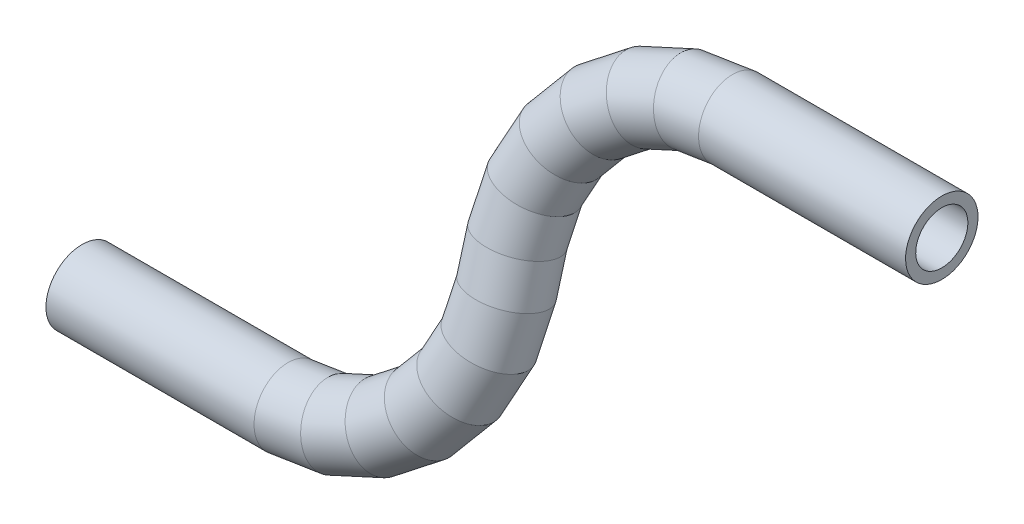
ISO-10303-21;
HEADER;
FILE_DESCRIPTION(('STEP AP214'),'2;1');
FILE_NAME('part.step','',(''),(''),'','','');
FILE_SCHEMA(('AUTOMOTIVE_DESIGN { 1 0 10303 214 1 1 1 1 }'));
ENDSEC;
DATA;
#1=APPLICATION_CONTEXT('core data for automotive mechanical design processes');
#2=APPLICATION_PROTOCOL_DEFINITION('international standard','automotive_design',2000,#1);
#3=PRODUCT_CONTEXT('',#1,'mechanical');
#4=PRODUCT('Part','Part','',(#3));
#5=PRODUCT_RELATED_PRODUCT_CATEGORY('part','',(#4));
#6=PRODUCT_DEFINITION_FORMATION('','',#4);
#7=PRODUCT_DEFINITION_CONTEXT('part definition',#1,'design');
#8=PRODUCT_DEFINITION('design','',#6,#7);
#9=PRODUCT_DEFINITION_SHAPE('','',#8);
#10=(LENGTH_UNIT() NAMED_UNIT(*) SI_UNIT(.MILLI.,.METRE.));
#11=(NAMED_UNIT(*) PLANE_ANGLE_UNIT() SI_UNIT($,.RADIAN.));
#12=(NAMED_UNIT(*) SI_UNIT($,.STERADIAN.) SOLID_ANGLE_UNIT());
#13=UNCERTAINTY_MEASURE_WITH_UNIT(LENGTH_MEASURE(1.E-05),#10,'distance_accuracy_value','');
#14=(GEOMETRIC_REPRESENTATION_CONTEXT(3) GLOBAL_UNCERTAINTY_ASSIGNED_CONTEXT((#13)) GLOBAL_UNIT_ASSIGNED_CONTEXT((#10,
#11,#12)) REPRESENTATION_CONTEXT('',''));
#15=CARTESIAN_POINT('',(0.,0.,0.));
#16=DIRECTION('',(0.,0.,1.));
#17=DIRECTION('',(1.,0.,0.));
#18=AXIS2_PLACEMENT_3D('',#15,#16,#17);
#19=CARTESIAN_POINT('',(-2802.49044779569,-59.0884651807333,-10.4188906600165));
#20=DIRECTION('',(-1.,0.,0.));
#21=DIRECTION('',(0.,0.,1.));
#22=AXIS2_PLACEMENT_3D('',#19,#20,#21);
#23=CYLINDRICAL_SURFACE('',#22,3.175);
#24=CARTESIAN_POINT('',(-2803.09277838077,-59.0884651807324,-10.4188906600161));
#25=DIRECTION('',(-0.997858923238604,-0.0630268367093302,0.0174696069649534));
#26=DIRECTION('',(0.065403129230141,-0.961603705422154,0.266534696437986));
#27=AXIS2_PLACEMENT_3D('',#24,#25,#26);
#28=ELLIPSE('',#27,3.18181250481318,3.175);
#29=CARTESIAN_POINT('',(-2802.88467788634,-62.1481078753193,-9.5708272299231));
#30=VERTEX_POINT('',#29);
#31=EDGE_CURVE('E45',#30,#30,#28,.T.);
#32=ORIENTED_EDGE('',*,*,#31,.T.);
#33=EDGE_LOOP('',(#32));
#34=FACE_BOUND('',#33,.T.);
#35=CARTESIAN_POINT('',(-2821.29277838078,-59.0884651807333,-10.4188906600165));
#36=DIRECTION('',(1.,0.,0.));
#37=DIRECTION('',(0.,0.,-1.));
#38=AXIS2_PLACEMENT_3D('',#35,#36,#37);
#39=CIRCLE('',#38,3.175);
#40=CARTESIAN_POINT('',(-2821.29277838078,-59.0884651807333,-13.5938906600165));
#41=VERTEX_POINT('',#40);
#42=EDGE_CURVE('E98',#41,#41,#39,.T.);
#43=ORIENTED_EDGE('',*,*,#42,.T.);
#44=EDGE_LOOP('',(#43));
#45=FACE_BOUND('',#44,.T.);
#46=ADVANCED_FACE('F39',(#34,#45),#23,.T.);
#47=CARTESIAN_POINT('',(-2798.11098455573,-58.4564291523097,-10.5940766852192));
#48=DIRECTION('',(-0.991444861373811,-0.125783782827815,0.0348644063909001));
#49=DIRECTION('',(0.125860299372411,-0.992047975171507,0.));
#50=AXIS2_PLACEMENT_3D('',#47,#48,#49);
#51=CYLINDRICAL_SURFACE('',#50,3.175);
#52=CARTESIAN_POINT('',(-2799.21049270424,-58.5959228342657,-10.5554122063225));
#53=DIRECTION('',(-0.965925826289071,-0.249415370257592,0.0691322731222119));
#54=DIRECTION('',(0.258819045102511,-0.930830833989973,0.258005155734833));
#55=AXIS2_PLACEMENT_3D('',#52,#53,#54);
#56=ELLIPSE('',#55,3.20239694984198,3.175);
#57=CARTESIAN_POINT('',(-2798.38165138364,-61.5768126578541,-9.72917728255378));
#58=VERTEX_POINT('',#57);
#59=EDGE_CURVE('E136',#58,#58,#56,.T.);
#60=ORIENTED_EDGE('',*,*,#59,.T.);
#61=EDGE_LOOP('',(#60));
#62=FACE_BOUND('',#61,.T.);
#63=ORIENTED_EDGE('',*,*,#31,.F.);
#64=EDGE_LOOP('',(#63));
#65=FACE_BOUND('',#64,.T.);
#66=ADVANCED_FACE('F144',(#62,#65),#51,.T.);
#67=CARTESIAN_POINT('',(-2794.56819989556,-56.7428869598459,-11.0690316438229));
#68=DIRECTION('',(-0.923879532511293,-0.368779391551257,0.102217267493316));
#69=DIRECTION('',(0.370721193089206,-0.928744204285828,0.));
#70=AXIS2_PLACEMENT_3D('',#67,#68,#69);
#71=CYLINDRICAL_SURFACE('',#70,3.175);
#72=CARTESIAN_POINT('',(-2795.59277838077,-57.1518617418139,-10.9556731274737));
#73=DIRECTION('',(-0.866025403784437,-0.481833495210536,0.133553296077634));
#74=DIRECTION('',(0.500000000000002,-0.83456009449314,0.231321094324751));
#75=AXIS2_PLACEMENT_3D('',#72,#73,#74);
#76=ELLIPSE('',#75,3.20239694984199,3.175);
#77=CARTESIAN_POINT('',(-2793.99157990585,-59.8244544428786,-10.214891160574));
#78=VERTEX_POINT('',#77);
#79=EDGE_CURVE('E131',#78,#78,#76,.T.);
#80=ORIENTED_EDGE('',*,*,#79,.T.);
#81=EDGE_LOOP('',(#80));
#82=FACE_BOUND('',#81,.T.);
#83=ORIENTED_EDGE('',*,*,#59,.F.);
#84=EDGE_LOOP('',(#83));
#85=FACE_BOUND('',#84,.T.);
#86=ADVANCED_FACE('F150',(#82,#85),#71,.T.);
#87=CARTESIAN_POINT('',(-2791.60635117163,-54.2041073539519,-11.7727236614019));
#88=DIRECTION('',(-0.793353340291223,-0.586643294177278,0.162604190738094));
#89=DIRECTION('',(0.594556014914912,-0.804054192905241,0.));
#90=AXIS2_PLACEMENT_3D('',#87,#88,#89);
#91=CYLINDRICAL_SURFACE('',#90,3.175);
#92=CARTESIAN_POINT('',(-2792.48617666298,-54.854692280402,-11.5923963031556));
#93=DIRECTION('',(-0.70710678118655,-0.681415463732367,0.188872882612618));
#94=DIRECTION('',(0.707106781186545,-0.681415463732371,0.188872882612621));
#95=AXIS2_PLACEMENT_3D('',#92,#93,#94);
#96=ELLIPSE('',#95,3.20239694984198,3.175);
#97=CARTESIAN_POINT('',(-2790.22174006369,-57.0368550830337,-10.9875503599691));
#98=VERTEX_POINT('',#97);
#99=EDGE_CURVE('E132',#98,#98,#96,.T.);
#100=ORIENTED_EDGE('',*,*,#99,.T.);
#101=EDGE_LOOP('',(#100));
#102=FACE_BOUND('',#101,.T.);
#103=ORIENTED_EDGE('',*,*,#79,.F.);
#104=EDGE_LOOP('',(#103));
#105=FACE_BOUND('',#104,.T.);
#106=ADVANCED_FACE('F155',(#102,#105),#91,.T.);
#107=CARTESIAN_POINT('',(-2789.42728347979,-51.0131039692365,-12.6571972898643));
#108=DIRECTION('',(-0.608761429008741,-0.764528425778941,0.211909907100186));
#109=DIRECTION('',(0.782294965954715,-0.622908168385928,0.));
#110=AXIS2_PLACEMENT_3D('',#107,#108,#109);
#111=CYLINDRICAL_SURFACE('',#110,3.175);
#112=CARTESIAN_POINT('',(-2790.10239732401,-51.8609627525749,-12.4221901011805));
#113=DIRECTION('',(-0.50000000000001,-0.834560094493135,0.231321094324749));
#114=DIRECTION('',(0.866025403784433,-0.481833495210544,0.133553296077635));
#115=AXIS2_PLACEMENT_3D('',#112,#113,#114);
#116=ELLIPSE('',#115,3.20239694984199,3.175);
#117=CARTESIAN_POINT('',(-2787.32904021244,-53.4039848679688,-11.9944994331802));
#118=VERTEX_POINT('',#117);
#119=EDGE_CURVE('E126',#118,#118,#116,.T.);
#120=ORIENTED_EDGE('',*,*,#119,.T.);
#121=EDGE_LOOP('',(#120));
#122=FACE_BOUND('',#121,.T.);
#123=ORIENTED_EDGE('',*,*,#99,.F.);
#124=EDGE_LOOP('',(#123));
#125=FACE_BOUND('',#124,.T.);
#126=ADVANCED_FACE('F266',(#122,#125),#111,.T.);
#127=CARTESIAN_POINT('',(-2788.17949668215,-47.3873384129861,-13.6621771130925));
#128=DIRECTION('',(-0.382683432365086,-0.890312208606777,0.246774313491092));
#129=DIRECTION('',(0.91872565648036,-0.394896401762198,0.));
#130=AXIS2_PLACEMENT_3D('',#127,#128,#129);
#131=CYLINDRICAL_SURFACE('',#130,3.175);
#132=CARTESIAN_POINT('',(-2788.60389098644,-48.3746908782804,-13.3885054455116));
#133=DIRECTION('',(-0.258819045102501,-0.930830833989975,0.258005155734835));
#134=DIRECTION('',(0.965925826289074,-0.249415370257582,0.0691322731222098));
#135=AXIS2_PLACEMENT_3D('',#132,#133,#134);
#136=ELLIPSE('',#135,3.20239694984199,3.175);
#137=CARTESIAN_POINT('',(-2785.51061306656,-49.173417899237,-13.1671164649294));
#138=VERTEX_POINT('',#137);
#139=EDGE_CURVE('E124',#138,#138,#136,.T.);
#140=ORIENTED_EDGE('',*,*,#139,.T.);
#141=EDGE_LOOP('',(#140));
#142=FACE_BOUND('',#141,.T.);
#143=ORIENTED_EDGE('',*,*,#119,.F.);
#144=EDGE_LOOP('',(#143));
#145=FACE_BOUND('',#144,.T.);
#146=ADVANCED_FACE('F265',(#142,#145),#131,.T.);
#147=CARTESIAN_POINT('',(-2788.01415846305,-44.0579800191205,-14.5849996062237));
#148=DIRECTION('',(-0.130526192220016,-0.955422685728538,0.264821458231411));
#149=DIRECTION('',(0.,-0.267106592155267,-0.963666990421069));
#150=AXIS2_PLACEMENT_3D('',#147,#148,#149);
#151=CYLINDRICAL_SURFACE('',#150,3.175);
#152=CARTESIAN_POINT('',(-2788.09277838078,-44.6334603244165,-14.4254895423451));
#153=DIRECTION('',(-0.065403129230125,-0.961603705422154,0.266534696437988));
#154=DIRECTION('',(0.997858923238605,-0.0630268367093154,0.0174696069649468));
#155=AXIS2_PLACEMENT_3D('',#152,#153,#154);
#156=ELLIPSE('',#155,3.18181250481317,3.175);
#157=CARTESIAN_POINT('',(-2784.91777838077,-44.833999901597,-14.3699045284499));
#158=VERTEX_POINT('',#157);
#159=EDGE_CURVE('E125',#158,#158,#156,.T.);
#160=ORIENTED_EDGE('',*,*,#159,.T.);
#161=EDGE_LOOP('',(#160));
#162=FACE_BOUND('',#161,.T.);
#163=ORIENTED_EDGE('',*,*,#139,.F.);
#164=EDGE_LOOP('',(#163));
#165=FACE_BOUND('',#164,.T.);
#166=ADVANCED_FACE('F256',(#162,#165),#151,.T.);
#167=CARTESIAN_POINT('',(-2788.09277838078,-40.5721195685249,-15.551200913255));
#168=DIRECTION('',(0.,-0.963666990421069,0.267106592155267));
#169=DIRECTION('',(0.,-0.267106592155267,-0.963666990421069));
#170=AXIS2_PLACEMENT_3D('',#167,#168,#169);
#171=CYLINDRICAL_SURFACE('',#170,3.175);
#172=CARTESIAN_POINT('',(-2788.09277838077,-41.1525656706894,-15.390314443323));
#173=DIRECTION('',(-0.0654031292301811,-0.961603705422151,0.266534696437987));
#174=DIRECTION('',(-0.997858923238601,0.0630268367093671,-0.0174696069649708));
#175=AXIS2_PLACEMENT_3D('',#172,#173,#174);
#176=ELLIPSE('',#175,3.18181250481319,3.175);
#177=CARTESIAN_POINT('',(-2791.26777838077,-40.9520260935087,-15.4458994572183));
#178=VERTEX_POINT('',#177);
#179=EDGE_CURVE('E116',#178,#178,#176,.T.);
#180=ORIENTED_EDGE('',*,*,#179,.T.);
#181=EDGE_LOOP('',(#180));
#182=FACE_BOUND('',#181,.T.);
#183=ORIENTED_EDGE('',*,*,#159,.F.);
#184=EDGE_LOOP('',(#183));
#185=FACE_BOUND('',#184,.T.);
#186=ADVANCED_FACE('F255',(#182,#185),#171,.T.);
#187=CARTESIAN_POINT('',(-2787.43691278124,-36.3517754084079,-16.7209844147514));
#188=DIRECTION('',(-0.130526192220127,-0.955422685728524,0.264821458231406));
#189=DIRECTION('',(0.,-0.267106592155266,-0.963666990421069));
#190=AXIS2_PLACEMENT_3D('',#187,#188,#189);
#191=CYLINDRICAL_SURFACE('',#190,3.175);
#192=CARTESIAN_POINT('',(-2787.58166577511,-37.4113351168251,-16.4272985401559));
#193=DIRECTION('',(-0.258819045102505,-0.930830833989974,0.258005155734835));
#194=DIRECTION('',(-0.965925826289073,0.249415370257587,-0.0691322731222052));
#195=AXIS2_PLACEMENT_3D('',#192,#193,#194);
#196=ELLIPSE('',#195,3.20239694984195,3.175);
#197=CARTESIAN_POINT('',(-2790.67494369499,-36.6126080958685,-16.6486875207381));
#198=VERTEX_POINT('',#197);
#199=EDGE_CURVE('E117',#198,#198,#196,.T.);
#200=ORIENTED_EDGE('',*,*,#199,.T.);
#201=EDGE_LOOP('',(#200));
#202=FACE_BOUND('',#201,.T.);
#203=ORIENTED_EDGE('',*,*,#179,.F.);
#204=EDGE_LOOP('',(#203));
#205=FACE_BOUND('',#204,.T.);
#206=ADVANCED_FACE('F249',(#202,#205),#191,.T.);
#207=CARTESIAN_POINT('',(-2785.65876513325,-32.9377107772362,-17.6672855520679));
#208=DIRECTION('',(-0.382683432364989,-0.890312208606816,0.246774313491103));
#209=DIRECTION('',(0.918725656480403,-0.394896401762098,0.));
#210=AXIS2_PLACEMENT_3D('',#207,#208,#209);
#211=CYLINDRICAL_SURFACE('',#210,3.175);
#212=CARTESIAN_POINT('',(-2786.08315943754,-33.9250632425311,-17.3936138844873));
#213=DIRECTION('',(-0.499999999999964,-0.834560094493161,0.231321094324756));
#214=DIRECTION('',(-0.866025403784459,0.481833495210498,-0.13355329607763));
#215=AXIS2_PLACEMENT_3D('',#212,#213,#214);
#216=ELLIPSE('',#215,3.20239694984201,3.175);
#217=CARTESIAN_POINT('',(-2788.85651654911,-32.3820411271373,-17.8213045524876));
#218=VERTEX_POINT('',#217);
#219=EDGE_CURVE('E114',#218,#218,#216,.T.);
#220=ORIENTED_EDGE('',*,*,#219,.T.);
#221=EDGE_LOOP('',(#220));
#222=FACE_BOUND('',#221,.T.);
#223=ORIENTED_EDGE('',*,*,#199,.F.);
#224=EDGE_LOOP('',(#223));
#225=FACE_BOUND('',#224,.T.);
#226=ADVANCED_FACE('F246',(#222,#225),#211,.T.);
#227=CARTESIAN_POINT('',(-2783.02426625435,-30.0834749313652,-18.458414871196));
#228=DIRECTION('',(-0.608761429008741,-0.764528425778941,0.211909907100185));
#229=DIRECTION('',(0.782294965954715,-0.622908168385928,0.));
#230=AXIS2_PLACEMENT_3D('',#227,#228,#229);
#231=CYLINDRICAL_SURFACE('',#230,3.175);
#232=CARTESIAN_POINT('',(-2783.69938009857,-30.9313337147039,-18.223407682512));
#233=DIRECTION('',(-0.70710678118655,-0.681415463732367,0.188872882612618));
#234=DIRECTION('',(-0.707106781186545,0.681415463732372,-0.188872882612615));
#235=AXIS2_PLACEMENT_3D('',#232,#233,#234);
#236=ELLIPSE('',#235,3.20239694984198,3.175);
#237=CARTESIAN_POINT('',(-2785.96381669786,-28.7491709120722,-18.8282536256985));
#238=VERTEX_POINT('',#237);
#239=EDGE_CURVE('E109',#238,#238,#236,.T.);
#240=ORIENTED_EDGE('',*,*,#239,.T.);
#241=EDGE_LOOP('',(#240));
#242=FACE_BOUND('',#241,.T.);
#243=ORIENTED_EDGE('',*,*,#219,.F.);
#244=EDGE_LOOP('',(#243));
#245=FACE_BOUND('',#244,.T.);
#246=ADVANCED_FACE('F245',(#242,#245),#231,.T.);
#247=CARTESIAN_POINT('',(-2779.71295288943,-27.9835793268419,-19.0404582164402));
#248=DIRECTION('',(-0.793353340291223,-0.586643294177278,0.162604190738095));
#249=DIRECTION('',(0.594556014914912,-0.804054192905241,0.));
#250=AXIS2_PLACEMENT_3D('',#247,#248,#249);
#251=CYLINDRICAL_SURFACE('',#250,3.175);
#252=CARTESIAN_POINT('',(-2780.59277838077,-28.6341642532924,-18.8601308581939));
#253=DIRECTION('',(-0.866025403784438,-0.481833495210535,0.133553296077634));
#254=DIRECTION('',(-0.500000000000001,0.83456009449314,-0.231321094324751));
#255=AXIS2_PLACEMENT_3D('',#252,#253,#254);
#256=ELLIPSE('',#255,3.20239694984199,3.175);
#257=CARTESIAN_POINT('',(-2782.1939768557,-25.9615715522277,-19.6009128250936));
#258=VERTEX_POINT('',#257);
#259=EDGE_CURVE('E110',#258,#258,#256,.T.);
#260=ORIENTED_EDGE('',*,*,#259,.T.);
#261=EDGE_LOOP('',(#260));
#262=FACE_BOUND('',#261,.T.);
#263=ORIENTED_EDGE('',*,*,#239,.F.);
#264=EDGE_LOOP('',(#263));
#265=FACE_BOUND('',#264,.T.);
#266=ADVANCED_FACE('F236',(#262,#265),#251,.T.);
#267=CARTESIAN_POINT('',(-2775.9504855721,-26.7811283788726,-19.3737502956943));
#268=DIRECTION('',(-0.923879532511293,-0.368779391551255,0.102217267493316));
#269=DIRECTION('',(0.370721193089203,-0.928744204285829,0.));
#270=AXIS2_PLACEMENT_3D('',#267,#268,#269);
#271=CYLINDRICAL_SURFACE('',#270,3.175);
#272=CARTESIAN_POINT('',(-2776.97506405731,-27.1901031608397,-19.2603917793451));
#273=DIRECTION('',(-0.965925826289071,-0.249415370257591,0.0691322731222122));
#274=DIRECTION('',(-0.258819045102511,0.930830833989973,-0.258005155734835));
#275=AXIS2_PLACEMENT_3D('',#272,#273,#274);
#276=ELLIPSE('',#275,3.20239694984198,3.175);
#277=CARTESIAN_POINT('',(-2777.80390537791,-24.2092133372514,-20.0866267031138));
#278=VERTEX_POINT('',#277);
#279=EDGE_CURVE('E102',#278,#278,#276,.T.);
#280=ORIENTED_EDGE('',*,*,#279,.T.);
#281=EDGE_LOOP('',(#280));
#282=FACE_BOUND('',#281,.T.);
#283=ORIENTED_EDGE('',*,*,#259,.F.);
#284=EDGE_LOOP('',(#283));
#285=FACE_BOUND('',#284,.T.);
#286=ADVANCED_FACE('F233',(#282,#285),#271,.T.);
#287=CARTESIAN_POINT('',(-2772.49560081735,-26.6217973948688,-19.4179132239516));
#288=DIRECTION('',(-0.991444861373811,-0.125783782827816,0.0348644063909005));
#289=DIRECTION('',(0.125860299372412,-0.992047975171507,0.));
#290=AXIS2_PLACEMENT_3D('',#287,#288,#289);
#291=CYLINDRICAL_SURFACE('',#290,3.175);
#292=CARTESIAN_POINT('',(-2773.09277838077,-26.6975608143733,-19.3969133256516));
#293=DIRECTION('',(-0.997858923238604,-0.0630268367093306,0.0174696069649536));
#294=DIRECTION('',(-0.0654031292301415,0.961603705422153,-0.266534696437988));
#295=AXIS2_PLACEMENT_3D('',#292,#293,#294);
#296=ELLIPSE('',#295,3.18181250481318,3.175);
#297=CARTESIAN_POINT('',(-2773.30087887521,-23.6379181197864,-20.2449767557446));
#298=VERTEX_POINT('',#297);
#299=EDGE_CURVE('E101',#298,#298,#296,.T.);
#300=ORIENTED_EDGE('',*,*,#299,.T.);
#301=EDGE_LOOP('',(#300));
#302=FACE_BOUND('',#301,.T.);
#303=ORIENTED_EDGE('',*,*,#279,.F.);
#304=EDGE_LOOP('',(#303));
#305=FACE_BOUND('',#304,.T.);
#306=ADVANCED_FACE('F228',(#302,#305),#291,.T.);
#307=CARTESIAN_POINT('',(-2754.89277838077,-26.6975608143733,-19.3969133256516));
#308=DIRECTION('',(-1.,0.,0.));
#309=DIRECTION('',(0.,0.,1.));
#310=AXIS2_PLACEMENT_3D('',#307,#308,#309);
#311=CYLINDRICAL_SURFACE('',#310,3.175);
#312=CARTESIAN_POINT('',(-2754.89277838077,-26.6975608143733,-19.3969133256516));
#313=DIRECTION('',(1.,0.,0.));
#314=DIRECTION('',(0.,0.,-1.));
#315=AXIS2_PLACEMENT_3D('',#312,#313,#314);
#316=CIRCLE('',#315,3.175);
#317=CARTESIAN_POINT('',(-2754.89277838077,-26.6975608143733,-22.5719133256516));
#318=VERTEX_POINT('',#317);
#319=EDGE_CURVE('E92',#318,#318,#316,.T.);
#320=ORIENTED_EDGE('',*,*,#319,.F.);
#321=EDGE_LOOP('',(#320));
#322=FACE_BOUND('',#321,.T.);
#323=ORIENTED_EDGE('',*,*,#299,.F.);
#324=EDGE_LOOP('',(#323));
#325=FACE_BOUND('',#324,.T.);
#326=ADVANCED_FACE('F227',(#322,#325),#311,.T.);
#327=CARTESIAN_POINT('',(-2821.29277838078,-59.0884651807333,-10.4188906600165));
#328=DIRECTION('',(1.,0.,0.));
#329=DIRECTION('',(0.,0.,-1.));
#330=AXIS2_PLACEMENT_3D('',#327,#328,#329);
#331=PLANE('',#330);
#332=CARTESIAN_POINT('',(-2821.29277838078,-59.0884651807333,-10.4188906600165));
#333=DIRECTION('',(1.,0.,0.));
#334=DIRECTION('',(0.,0.,-1.));
#335=AXIS2_PLACEMENT_3D('',#332,#333,#334);
#336=CIRCLE('',#335,2.286);
#337=CARTESIAN_POINT('',(-2821.29277838078,-59.0884651807333,-12.7048906600165));
#338=VERTEX_POINT('',#337);
#339=EDGE_CURVE('E95',#338,#338,#336,.F.);
#340=ORIENTED_EDGE('',*,*,#339,.F.);
#341=EDGE_LOOP('',(#340));
#342=FACE_BOUND('',#341,.T.);
#343=ORIENTED_EDGE('',*,*,#42,.F.);
#344=EDGE_LOOP('',(#343));
#345=FACE_BOUND('',#344,.T.);
#346=ADVANCED_FACE('F225',(#342,#345),#331,.F.);
#347=CARTESIAN_POINT('',(-2754.89277838077,-26.6975608143733,-19.3969133256516));
#348=DIRECTION('',(1.,0.,0.));
#349=DIRECTION('',(0.,0.,-1.));
#350=AXIS2_PLACEMENT_3D('',#347,#348,#349);
#351=PLANE('',#350);
#352=CARTESIAN_POINT('',(-2754.89277838077,-26.6975608143733,-19.3969133256516));
#353=DIRECTION('',(1.,0.,0.));
#354=DIRECTION('',(0.,0.,-1.));
#355=AXIS2_PLACEMENT_3D('',#352,#353,#354);
#356=CIRCLE('',#355,2.286);
#357=CARTESIAN_POINT('',(-2754.89277838077,-26.6975608143733,-21.6829133256516));
#358=VERTEX_POINT('',#357);
#359=EDGE_CURVE('E46',#358,#358,#356,.F.);
#360=ORIENTED_EDGE('',*,*,#359,.T.);
#361=EDGE_LOOP('',(#360));
#362=FACE_BOUND('',#361,.T.);
#363=ORIENTED_EDGE('',*,*,#319,.T.);
#364=EDGE_LOOP('',(#363));
#365=FACE_BOUND('',#364,.T.);
#366=ADVANCED_FACE('F217',(#362,#365),#351,.T.);
#367=CARTESIAN_POINT('',(-2802.63110035952,-59.0884651807333,-10.4188906600165));
#368=DIRECTION('',(-1.,0.,0.));
#369=DIRECTION('',(0.,0.,1.));
#370=AXIS2_PLACEMENT_3D('',#367,#368,#369);
#371=CYLINDRICAL_SURFACE('',#370,2.286);
#372=CARTESIAN_POINT('',(-2803.09277838077,-59.0884651807324,-10.4188906600161));
#373=DIRECTION('',(-0.997858923238604,-0.0630268367093302,0.0174696069649534));
#374=DIRECTION('',(0.065403129230141,-0.961603705422154,0.266534696437987));
#375=AXIS2_PLACEMENT_3D('',#372,#373,#374);
#376=ELLIPSE('',#375,2.29090500346549,2.286);
#377=CARTESIAN_POINT('',(-2802.94294602478,-61.291407920835,-9.80828499034911));
#378=VERTEX_POINT('',#377);
#379=EDGE_CURVE('E90',#378,#378,#376,.F.);
#380=ORIENTED_EDGE('',*,*,#379,.T.);
#381=EDGE_LOOP('',(#380));
#382=FACE_BOUND('',#381,.T.);
#383=ORIENTED_EDGE('',*,*,#339,.T.);
#384=EDGE_LOOP('',(#383));
#385=FACE_BOUND('',#384,.T.);
#386=ADVANCED_FACE('F212',(#382,#385),#371,.F.);
#387=CARTESIAN_POINT('',(-2798.39108638119,-58.4919654373383,-10.5842268345071));
#388=DIRECTION('',(-0.991444861373811,-0.125783782827815,0.0348644063909001));
#389=DIRECTION('',(0.125860299372411,-0.992047975171507,0.));
#390=AXIS2_PLACEMENT_3D('',#387,#388,#389);
#391=CYLINDRICAL_SURFACE('',#390,2.286);
#392=CARTESIAN_POINT('',(-2799.21049270424,-58.5959228342658,-10.5554122063225));
#393=DIRECTION('',(-0.965925826289071,-0.249415370257592,0.0691322731222119));
#394=DIRECTION('',(0.258819045102511,-0.930830833989973,0.258005155734833));
#395=AXIS2_PLACEMENT_3D('',#392,#393,#394);
#396=ELLIPSE('',#395,2.30572580388623,2.286);
#397=CARTESIAN_POINT('',(-2798.61372695341,-60.7421635072494,-9.96052306120905));
#398=VERTEX_POINT('',#397);
#399=EDGE_CURVE('E88',#398,#398,#396,.F.);
#400=ORIENTED_EDGE('',*,*,#399,.T.);
#401=EDGE_LOOP('',(#400));
#402=FACE_BOUND('',#401,.T.);
#403=ORIENTED_EDGE('',*,*,#379,.F.);
#404=EDGE_LOOP('',(#403));
#405=FACE_BOUND('',#404,.T.);
#406=ADVANCED_FACE('F209',(#402,#405),#391,.F.);
#407=CARTESIAN_POINT('',(-2794.82921324451,-56.8470740758332,-11.040153342735));
#408=DIRECTION('',(-0.923879532511293,-0.368779391551257,0.102217267493316));
#409=DIRECTION('',(0.370721193089206,-0.928744204285828,0.));
#410=AXIS2_PLACEMENT_3D('',#407,#408,#409);
#411=CYLINDRICAL_SURFACE('',#410,2.286);
#412=CARTESIAN_POINT('',(-2795.59277838077,-57.1518617418138,-10.9556731274737));
#413=DIRECTION('',(-0.866025403784437,-0.481833495210536,0.133553296077634));
#414=DIRECTION('',(0.500000000000002,-0.83456009449314,0.231321094324751));
#415=AXIS2_PLACEMENT_3D('',#412,#413,#414);
#416=ELLIPSE('',#415,2.30572580388623,2.286);
#417=CARTESIAN_POINT('',(-2794.43991547883,-59.0761284865804,-10.4223101113059));
#418=VERTEX_POINT('',#417);
#419=EDGE_CURVE('E82',#418,#418,#416,.F.);
#420=ORIENTED_EDGE('',*,*,#419,.T.);
#421=EDGE_LOOP('',(#420));
#422=FACE_BOUND('',#421,.T.);
#423=ORIENTED_EDGE('',*,*,#399,.F.);
#424=EDGE_LOOP('',(#423));
#425=FACE_BOUND('',#424,.T.);
#426=ADVANCED_FACE('F206',(#422,#425),#411,.F.);
#427=CARTESIAN_POINT('',(-2791.83048841568,-54.369845121121,-11.7267849184337));
#428=DIRECTION('',(-0.793353340291223,-0.586643294177278,0.162604190738094));
#429=DIRECTION('',(0.594556014914912,-0.804054192905241,0.));
#430=AXIS2_PLACEMENT_3D('',#427,#428,#429);
#431=CYLINDRICAL_SURFACE('',#430,2.286);
#432=CARTESIAN_POINT('',(-2792.48617666298,-54.854692280402,-11.5923963031555));
#433=DIRECTION('',(-0.70710678118655,-0.681415463732367,0.188872882612618));
#434=DIRECTION('',(0.707106781186545,-0.681415463732371,0.188872882612621));
#435=AXIS2_PLACEMENT_3D('',#432,#433,#434);
#436=ELLIPSE('',#435,2.30572580388622,2.286);
#437=CARTESIAN_POINT('',(-2790.85578231149,-56.4258494982969,-11.1569072240612));
#438=VERTEX_POINT('',#437);
#439=EDGE_CURVE('E78',#438,#438,#436,.F.);
#440=ORIENTED_EDGE('',*,*,#439,.T.);
#441=EDGE_LOOP('',(#440));
#442=FACE_BOUND('',#441,.T.);
#443=ORIENTED_EDGE('',*,*,#419,.F.);
#444=EDGE_LOOP('',(#443));
#445=FACE_BOUND('',#444,.T.);
#446=ADVANCED_FACE('F205',(#442,#445),#431,.F.);
#447=CARTESIAN_POINT('',(-2789.59927003616,-51.2290976326493,-12.5973287544315));
#448=DIRECTION('',(-0.608761429008741,-0.764528425778941,0.211909907100186));
#449=DIRECTION('',(0.782294965954715,-0.622908168385928,0.));
#450=AXIS2_PLACEMENT_3D('',#447,#448,#449);
#451=CYLINDRICAL_SURFACE('',#450,2.286);
#452=CARTESIAN_POINT('',(-2790.10239732401,-51.8609627525749,-12.4221901011806));
#453=DIRECTION('',(-0.50000000000001,-0.834560094493135,0.231321094324749));
#454=DIRECTION('',(0.866025403784433,-0.481833495210544,0.133553296077635));
#455=AXIS2_PLACEMENT_3D('',#452,#453,#454);
#456=ELLIPSE('',#455,2.30572580388623,2.286);
#457=CARTESIAN_POINT('',(-2788.10558020368,-52.9719386756585,-12.1142528202203));
#458=VERTEX_POINT('',#457);
#459=EDGE_CURVE('E80',#458,#458,#456,.F.);
#460=ORIENTED_EDGE('',*,*,#459,.T.);
#461=EDGE_LOOP('',(#460));
#462=FACE_BOUND('',#461,.T.);
#463=ORIENTED_EDGE('',*,*,#439,.F.);
#464=EDGE_LOOP('',(#463));
#465=FACE_BOUND('',#464,.T.);
#466=ADVANCED_FACE('F196',(#462,#465),#451,.F.);
#467=CARTESIAN_POINT('',(-2788.28761195124,-47.6388683614277,-13.5924587269477));
#468=DIRECTION('',(-0.382683432365086,-0.890312208606777,0.246774313491092));
#469=DIRECTION('',(0.91872565648036,-0.394896401762198,0.));
#470=AXIS2_PLACEMENT_3D('',#467,#468,#469);
#471=CYLINDRICAL_SURFACE('',#470,2.286);
#472=CARTESIAN_POINT('',(-2788.60389098644,-48.3746908782804,-13.3885054455117));
#473=DIRECTION('',(-0.258819045102501,-0.930830833989975,0.258005155734835));
#474=DIRECTION('',(0.965925826289074,-0.249415370257582,0.0691322731222106));
#475=AXIS2_PLACEMENT_3D('',#472,#473,#474);
#476=ELLIPSE('',#475,2.30572580388623,2.286);
#477=CARTESIAN_POINT('',(-2786.37673088412,-48.9497743333691,-13.2291053794925));
#478=VERTEX_POINT('',#477);
#479=EDGE_CURVE('E74',#478,#478,#476,.F.);
#480=ORIENTED_EDGE('',*,*,#479,.T.);
#481=EDGE_LOOP('',(#480));
#482=FACE_BOUND('',#481,.T.);
#483=ORIENTED_EDGE('',*,*,#459,.F.);
#484=EDGE_LOOP('',(#483));
#485=FACE_BOUND('',#484,.T.);
#486=ADVANCED_FACE('F193',(#482,#485),#471,.F.);
#487=CARTESIAN_POINT('',(-2788.03251730663,-44.1923626694032,-14.5477517891681));
#488=DIRECTION('',(-0.130526192220016,-0.955422685728538,0.264821458231411));
#489=DIRECTION('',(0.,-0.267106592155267,-0.963666990421069));
#490=AXIS2_PLACEMENT_3D('',#487,#488,#489);
#491=CYLINDRICAL_SURFACE('',#490,2.286);
#492=CARTESIAN_POINT('',(-2788.09277838078,-44.6334603244165,-14.4254895423451));
#493=DIRECTION('',(-0.065403129230125,-0.961603705422154,0.266534696437988));
#494=DIRECTION('',(0.997858923238605,-0.0630268367093148,0.0174696069649492));
#495=AXIS2_PLACEMENT_3D('',#492,#493,#494);
#496=ELLIPSE('',#495,2.29090500346548,2.286);
#497=CARTESIAN_POINT('',(-2785.80677838078,-44.7778488199865,-14.3854683323405));
#498=VERTEX_POINT('',#497);
#499=EDGE_CURVE('E72',#498,#498,#496,.F.);
#500=ORIENTED_EDGE('',*,*,#499,.T.);
#501=EDGE_LOOP('',(#500));
#502=FACE_BOUND('',#501,.T.);
#503=ORIENTED_EDGE('',*,*,#479,.F.);
#504=EDGE_LOOP('',(#503));
#505=FACE_BOUND('',#504,.T.);
#506=ADVANCED_FACE('F188',(#502,#505),#491,.F.);
#507=CARTESIAN_POINT('',(-2788.09277838078,-40.7076618013988,-15.5136316862544));
#508=DIRECTION('',(0.,-0.963666990421068,0.267106592155267));
#509=DIRECTION('',(0.,-0.267106592155267,-0.963666990421069));
#510=AXIS2_PLACEMENT_3D('',#507,#508,#509);
#511=CYLINDRICAL_SURFACE('',#510,2.286);
#512=CARTESIAN_POINT('',(-2788.09277838077,-41.1525656706894,-15.390314443323));
#513=DIRECTION('',(-0.0654031292301811,-0.961603705422151,0.266534696437987));
#514=DIRECTION('',(-0.997858923238601,0.0630268367093673,-0.0174696069649699));
#515=AXIS2_PLACEMENT_3D('',#512,#513,#514);
#516=ELLIPSE('',#515,2.29090500346549,2.286);
#517=CARTESIAN_POINT('',(-2790.37877838077,-41.0081771751193,-15.4303356533276));
#518=VERTEX_POINT('',#517);
#519=EDGE_CURVE('E67',#518,#518,#516,.F.);
#520=ORIENTED_EDGE('',*,*,#519,.T.);
#521=EDGE_LOOP('',(#520));
#522=FACE_BOUND('',#521,.T.);
#523=ORIENTED_EDGE('',*,*,#499,.F.);
#524=EDGE_LOOP('',(#523));
#525=FACE_BOUND('',#524,.T.);
#526=ADVANCED_FACE('F187',(#522,#525),#511,.F.);
#527=CARTESIAN_POINT('',(-2787.47378888614,-36.6217002915645,-16.6461673706952));
#528=DIRECTION('',(-0.130526192220127,-0.955422685728524,0.264821458231406));
#529=DIRECTION('',(0.,-0.267106592155266,-0.963666990421069));
#530=AXIS2_PLACEMENT_3D('',#527,#528,#529);
#531=CYLINDRICAL_SURFACE('',#530,2.286);
#532=CARTESIAN_POINT('',(-2787.58166577511,-37.4113351168251,-16.4272985401558));
#533=DIRECTION('',(-0.258819045102505,-0.930830833989974,0.258005155734835));
#534=DIRECTION('',(-0.965925826289073,0.249415370257587,-0.0691322731222043));
#535=AXIS2_PLACEMENT_3D('',#532,#533,#534);
#536=ELLIPSE('',#535,2.3057258038862,2.286);
#537=CARTESIAN_POINT('',(-2789.80882587743,-36.8362516617363,-16.586698606175));
#538=VERTEX_POINT('',#537);
#539=EDGE_CURVE('E63',#538,#538,#536,.F.);
#540=ORIENTED_EDGE('',*,*,#539,.T.);
#541=EDGE_LOOP('',(#540));
#542=FACE_BOUND('',#541,.T.);
#543=ORIENTED_EDGE('',*,*,#519,.F.);
#544=EDGE_LOOP('',(#543));
#545=FACE_BOUND('',#544,.T.);
#546=ADVANCED_FACE('F185',(#542,#545),#531,.F.);
#547=CARTESIAN_POINT('',(-2785.76688040235,-33.1892407256777,-17.597567165923));
#548=DIRECTION('',(-0.382683432364989,-0.890312208606816,0.246774313491103));
#549=DIRECTION('',(0.918725656480403,-0.394896401762098,0.));
#550=AXIS2_PLACEMENT_3D('',#547,#548,#549);
#551=CYLINDRICAL_SURFACE('',#550,2.286);
#552=CARTESIAN_POINT('',(-2786.08315943754,-33.9250632425313,-17.3936138844873));
#553=DIRECTION('',(-0.499999999999964,-0.834560094493161,0.231321094324756));
#554=DIRECTION('',(-0.86602540378446,0.481833495210498,-0.133553296077629));
#555=AXIS2_PLACEMENT_3D('',#552,#553,#554);
#556=ELLIPSE('',#555,2.30572580388625,2.286);
#557=CARTESIAN_POINT('',(-2788.07997655787,-32.8140873194478,-17.7015511654475));
#558=VERTEX_POINT('',#557);
#559=EDGE_CURVE('E65',#558,#558,#556,.F.);
#560=ORIENTED_EDGE('',*,*,#559,.T.);
#561=EDGE_LOOP('',(#560));
#562=FACE_BOUND('',#561,.T.);
#563=ORIENTED_EDGE('',*,*,#539,.F.);
#564=EDGE_LOOP('',(#563));
#565=FACE_BOUND('',#564,.T.);
#566=ADVANCED_FACE('F177',(#562,#565),#551,.F.);
#567=CARTESIAN_POINT('',(-2783.19625281072,-30.2994685947784,-18.3985463357633));
#568=DIRECTION('',(-0.608761429008741,-0.764528425778941,0.211909907100185));
#569=DIRECTION('',(0.782294965954715,-0.622908168385928,0.));
#570=AXIS2_PLACEMENT_3D('',#567,#568,#569);
#571=CYLINDRICAL_SURFACE('',#570,2.286);
#572=CARTESIAN_POINT('',(-2783.69938009857,-30.931333714704,-18.223407682512));
#573=DIRECTION('',(-0.70710678118655,-0.681415463732367,0.188872882612618));
#574=DIRECTION('',(-0.707106781186545,0.681415463732372,-0.188872882612616));
#575=AXIS2_PLACEMENT_3D('',#572,#573,#574);
#576=ELLIPSE('',#575,2.30572580388622,2.286);
#577=CARTESIAN_POINT('',(-2785.32977445006,-29.3601764968092,-18.6588967616063));
#578=VERTEX_POINT('',#577);
#579=EDGE_CURVE('E56',#578,#578,#576,.F.);
#580=ORIENTED_EDGE('',*,*,#579,.T.);
#581=EDGE_LOOP('',(#580));
#582=FACE_BOUND('',#581,.T.);
#583=ORIENTED_EDGE('',*,*,#559,.F.);
#584=EDGE_LOOP('',(#583));
#585=FACE_BOUND('',#584,.T.);
#586=ADVANCED_FACE('F171',(#582,#585),#571,.F.);
#587=CARTESIAN_POINT('',(-2779.93709013348,-28.1493170940113,-18.9945194734719));
#588=DIRECTION('',(-0.793353340291223,-0.586643294177278,0.162604190738095));
#589=DIRECTION('',(0.594556014914912,-0.804054192905241,0.));
#590=AXIS2_PLACEMENT_3D('',#587,#588,#589);
#591=CYLINDRICAL_SURFACE('',#590,2.286);
#592=CARTESIAN_POINT('',(-2780.59277838077,-28.6341642532925,-18.8601308581939));
#593=DIRECTION('',(-0.866025403784438,-0.481833495210535,0.133553296077634));
#594=DIRECTION('',(-0.500000000000001,0.83456009449314,-0.231321094324751));
#595=AXIS2_PLACEMENT_3D('',#592,#593,#594);
#596=ELLIPSE('',#595,2.30572580388624,2.286);
#597=CARTESIAN_POINT('',(-2781.74564128272,-26.7098975085259,-19.3934938743617));
#598=VERTEX_POINT('',#597);
#599=EDGE_CURVE('E57',#598,#598,#596,.F.);
#600=ORIENTED_EDGE('',*,*,#599,.T.);
#601=EDGE_LOOP('',(#600));
#602=FACE_BOUND('',#601,.T.);
#603=ORIENTED_EDGE('',*,*,#579,.F.);
#604=EDGE_LOOP('',(#603));
#605=FACE_BOUND('',#604,.T.);
#606=ADVANCED_FACE('F168',(#602,#605),#591,.F.);
#607=CARTESIAN_POINT('',(-2776.21149892105,-26.8853154948601,-19.3448719946063));
#608=DIRECTION('',(-0.923879532511293,-0.368779391551255,0.102217267493316));
#609=DIRECTION('',(0.370721193089203,-0.928744204285829,0.));
#610=AXIS2_PLACEMENT_3D('',#607,#608,#609);
#611=CYLINDRICAL_SURFACE('',#610,2.286);
#612=CARTESIAN_POINT('',(-2776.97506405731,-27.1901031608397,-19.2603917793451));
#613=DIRECTION('',(-0.965925826289071,-0.249415370257591,0.0691322731222122));
#614=DIRECTION('',(-0.258819045102511,0.930830833989973,-0.258005155734835));
#615=AXIS2_PLACEMENT_3D('',#612,#613,#614);
#616=ELLIPSE('',#615,2.30572580388623,2.286);
#617=CARTESIAN_POINT('',(-2777.57182980814,-25.0438624878561,-19.8552809244586));
#618=VERTEX_POINT('',#617);
#619=EDGE_CURVE('E51',#618,#618,#616,.F.);
#620=ORIENTED_EDGE('',*,*,#619,.T.);
#621=EDGE_LOOP('',(#620));
#622=FACE_BOUND('',#621,.T.);
#623=ORIENTED_EDGE('',*,*,#599,.F.);
#624=EDGE_LOOP('',(#623));
#625=FACE_BOUND('',#624,.T.);
#626=ADVANCED_FACE('F162',(#622,#625),#611,.F.);
#627=CARTESIAN_POINT('',(-2772.63505007899,-26.6394892064109,-19.4130094558065));
#628=DIRECTION('',(-0.991444861373811,-0.125783782827816,0.0348644063909005));
#629=DIRECTION('',(0.125860299372412,-0.992047975171507,0.));
#630=AXIS2_PLACEMENT_3D('',#627,#628,#629);
#631=CYLINDRICAL_SURFACE('',#630,2.286);
#632=CARTESIAN_POINT('',(-2773.09277838077,-26.6975608143733,-19.3969133256516));
#633=DIRECTION('',(-0.997858923238604,-0.0630268367093307,0.0174696069649536));
#634=DIRECTION('',(-0.0654031292301415,0.961603705422153,-0.266534696437988));
#635=AXIS2_PLACEMENT_3D('',#632,#633,#634);
#636=ELLIPSE('',#635,2.29090500346549,2.286);
#637=CARTESIAN_POINT('',(-2773.24261073677,-24.4946180742707,-20.0075189953186));
#638=VERTEX_POINT('',#637);
#639=EDGE_CURVE('E10',#638,#638,#636,.F.);
#640=ORIENTED_EDGE('',*,*,#639,.T.);
#641=EDGE_LOOP('',(#640));
#642=FACE_BOUND('',#641,.T.);
#643=ORIENTED_EDGE('',*,*,#619,.F.);
#644=EDGE_LOOP('',(#643));
#645=FACE_BOUND('',#644,.T.);
#646=ADVANCED_FACE('F160',(#642,#645),#631,.F.);
#647=CARTESIAN_POINT('',(-2754.89277838077,-26.6975608143733,-19.3969133256516));
#648=DIRECTION('',(-1.,0.,0.));
#649=DIRECTION('',(0.,0.,1.));
#650=AXIS2_PLACEMENT_3D('',#647,#648,#649);
#651=CYLINDRICAL_SURFACE('',#650,2.286);
#652=ORIENTED_EDGE('',*,*,#359,.F.);
#653=EDGE_LOOP('',(#652));
#654=FACE_BOUND('',#653,.T.);
#655=ORIENTED_EDGE('',*,*,#639,.F.);
#656=EDGE_LOOP('',(#655));
#657=FACE_BOUND('',#656,.T.);
#658=ADVANCED_FACE('F154',(#654,#657),#651,.F.);
#659=CLOSED_SHELL('',(#46,#66,#86,#106,#126,#146,#166,#186,#206,#226,#246,#266,#286,#306,#326,
#346,#366,#386,#406,#426,#446,#466,#486,#506,#526,#546,#566,#586,#606,#626,#646,#658));
#660=MANIFOLD_SOLID_BREP('B2',#659);
#661=ADVANCED_BREP_SHAPE_REPRESENTATION('',(#18,#660),#14);
#662=SHAPE_DEFINITION_REPRESENTATION(#9,#661);
ENDSEC;
END-ISO-10303-21;
